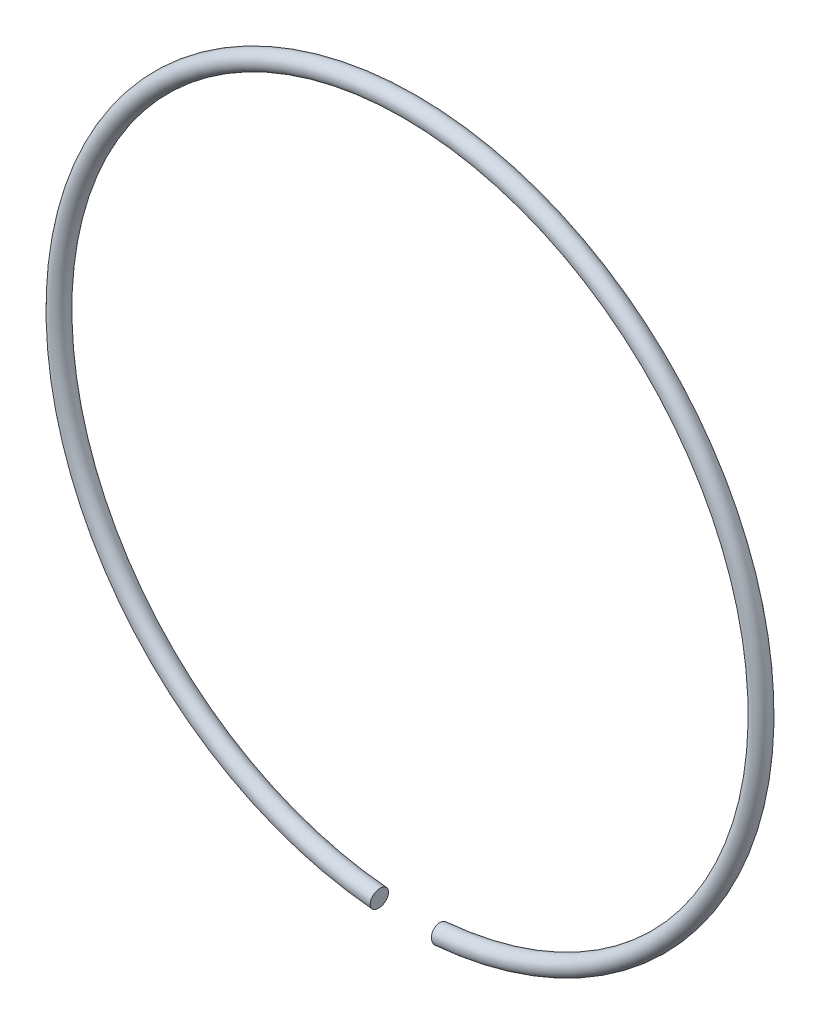
ISO-10303-21;
HEADER;
FILE_DESCRIPTION(('STEP AP214'),'2;1');
FILE_NAME('part.step','',(''),(''),'','','');
FILE_SCHEMA(('AUTOMOTIVE_DESIGN { 1 0 10303 214 1 1 1 1 }'));
ENDSEC;
DATA;
#1=APPLICATION_CONTEXT('core data for automotive mechanical design processes');
#2=APPLICATION_PROTOCOL_DEFINITION('international standard','automotive_design',2000,#1);
#3=PRODUCT_CONTEXT('',#1,'mechanical');
#4=PRODUCT('Part','Part','',(#3));
#5=PRODUCT_RELATED_PRODUCT_CATEGORY('part','',(#4));
#6=PRODUCT_DEFINITION_FORMATION('','',#4);
#7=PRODUCT_DEFINITION_CONTEXT('part definition',#1,'design');
#8=PRODUCT_DEFINITION('design','',#6,#7);
#9=PRODUCT_DEFINITION_SHAPE('','',#8);
#10=(LENGTH_UNIT() NAMED_UNIT(*) SI_UNIT(.MILLI.,.METRE.));
#11=(NAMED_UNIT(*) PLANE_ANGLE_UNIT() SI_UNIT($,.RADIAN.));
#12=(NAMED_UNIT(*) SI_UNIT($,.STERADIAN.) SOLID_ANGLE_UNIT());
#13=UNCERTAINTY_MEASURE_WITH_UNIT(LENGTH_MEASURE(1.E-05),#10,'distance_accuracy_value','');
#14=(GEOMETRIC_REPRESENTATION_CONTEXT(3) GLOBAL_UNCERTAINTY_ASSIGNED_CONTEXT((#13)) GLOBAL_UNIT_ASSIGNED_CONTEXT((#10,
#11,#12)) REPRESENTATION_CONTEXT('',''));
#15=CARTESIAN_POINT('',(0.,0.,0.));
#16=DIRECTION('',(0.,0.,1.));
#17=DIRECTION('',(1.,0.,0.));
#18=AXIS2_PLACEMENT_3D('',#15,#16,#17);
#19=CARTESIAN_POINT('',(0.,0.,0.));
#20=DIRECTION('',(0.,0.,1.));
#21=DIRECTION('',(1.,0.,0.));
#22=AXIS2_PLACEMENT_3D('',#19,#20,#21);
#23=TOROIDAL_SURFACE('',#22,57.5,1.5);
#24=CARTESIAN_POINT('',(5.01145520798996,-57.2811951402754,0.));
#25=DIRECTION('',(-0.996194698091746,-0.0871557427476515,0.));
#26=DIRECTION('',(0.,0.,-1.));
#27=AXIS2_PLACEMENT_3D('',#24,#25,#26);
#28=CIRCLE('',#27,1.5);
#29=CARTESIAN_POINT('',(5.14218882211144,-58.775487187413,0.));
#30=VERTEX_POINT('',#29);
#31=EDGE_CURVE('E10',#30,#30,#28,.T.);
#32=CARTESIAN_POINT('',(-5.01145520798997,-57.2811951402754,0.));
#33=DIRECTION('',(-0.996194698091746,0.0871557427476516,0.));
#34=DIRECTION('',(0.,0.,-1.));
#35=AXIS2_PLACEMENT_3D('',#32,#33,#34);
#36=CIRCLE('',#35,1.5);
#37=CARTESIAN_POINT('',(-5.14218882211144,-58.775487187413,0.));
#38=VERTEX_POINT('',#37);
#39=EDGE_CURVE('E49',#38,#38,#36,.T.);
#40=CARTESIAN_POINT('',(0.,0.,0.));
#41=DIRECTION('',(0.,0.,1.));
#42=DIRECTION('',(1.,0.,0.));
#43=AXIS2_PLACEMENT_3D('',#40,#41,#42);
#44=CIRCLE('',#43,59.);
#45=EDGE_CURVE('',#30,#38,#44,.T.);
#46=ORIENTED_EDGE('',*,*,#31,.F.);
#47=ORIENTED_EDGE('',*,*,#39,.T.);
#48=ORIENTED_EDGE('',*,*,#45,.T.);
#49=ORIENTED_EDGE('',*,*,#45,.F.);
#50=EDGE_LOOP('',(#46,#48,#47,#49));
#51=FACE_BOUND('',#50,.T.);
#52=ADVANCED_FACE('F42',(#51),#23,.T.);
#53=CARTESIAN_POINT('',(5.01145520798996,-57.2811951402754,0.));
#54=DIRECTION('',(-0.996194698091746,-0.0871557427476515,0.));
#55=DIRECTION('',(0.,0.,-1.));
#56=AXIS2_PLACEMENT_3D('',#53,#54,#55);
#57=PLANE('',#56);
#58=ORIENTED_EDGE('',*,*,#31,.T.);
#59=EDGE_LOOP('',(#58));
#60=FACE_BOUND('',#59,.T.);
#61=ADVANCED_FACE('F61',(#60),#57,.T.);
#62=CARTESIAN_POINT('',(-5.01145520798997,-57.2811951402754,0.));
#63=DIRECTION('',(-0.996194698091746,0.0871557427476516,0.));
#64=DIRECTION('',(0.,0.,-1.));
#65=AXIS2_PLACEMENT_3D('',#62,#63,#64);
#66=PLANE('',#65);
#67=ORIENTED_EDGE('',*,*,#39,.F.);
#68=EDGE_LOOP('',(#67));
#69=FACE_BOUND('',#68,.T.);
#70=ADVANCED_FACE('F59',(#69),#66,.F.);
#71=CLOSED_SHELL('',(#52,#61,#70));
#72=MANIFOLD_SOLID_BREP('B2',#71);
#73=ADVANCED_BREP_SHAPE_REPRESENTATION('',(#18,#72),#14);
#74=SHAPE_DEFINITION_REPRESENTATION(#9,#73);
ENDSEC;
END-ISO-10303-21;
